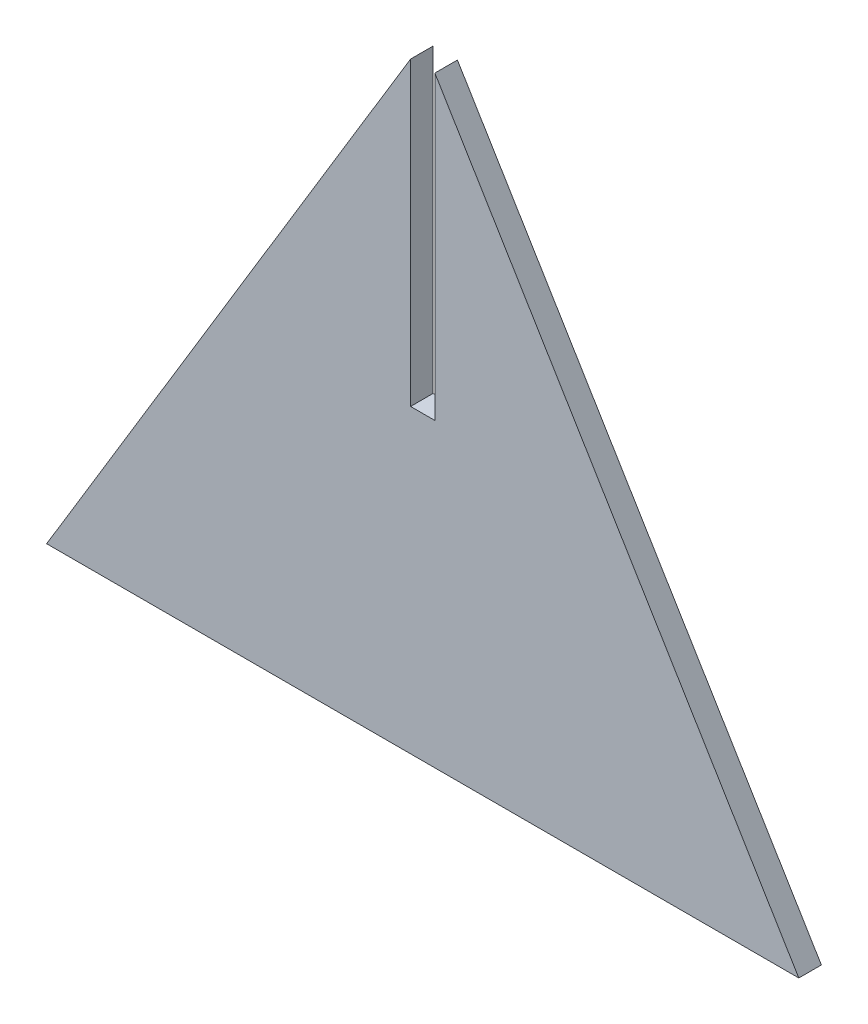
ISO-10303-21;
HEADER;
FILE_DESCRIPTION(('STEP AP214'),'2;1');
FILE_NAME('part.step','',(''),(''),'','','');
FILE_SCHEMA(('AUTOMOTIVE_DESIGN { 1 0 10303 214 1 1 1 1 }'));
ENDSEC;
DATA;
#1=APPLICATION_CONTEXT('core data for automotive mechanical design processes');
#2=APPLICATION_PROTOCOL_DEFINITION('international standard','automotive_design',2000,#1);
#3=PRODUCT_CONTEXT('',#1,'mechanical');
#4=PRODUCT('Part','Part','',(#3));
#5=PRODUCT_RELATED_PRODUCT_CATEGORY('part','',(#4));
#6=PRODUCT_DEFINITION_FORMATION('','',#4);
#7=PRODUCT_DEFINITION_CONTEXT('part definition',#1,'design');
#8=PRODUCT_DEFINITION('design','',#6,#7);
#9=PRODUCT_DEFINITION_SHAPE('','',#8);
#10=(LENGTH_UNIT() NAMED_UNIT(*) SI_UNIT(.MILLI.,.METRE.));
#11=(NAMED_UNIT(*) PLANE_ANGLE_UNIT() SI_UNIT($,.RADIAN.));
#12=(NAMED_UNIT(*) SI_UNIT($,.STERADIAN.) SOLID_ANGLE_UNIT());
#13=UNCERTAINTY_MEASURE_WITH_UNIT(LENGTH_MEASURE(1.E-05),#10,'distance_accuracy_value','');
#14=(GEOMETRIC_REPRESENTATION_CONTEXT(3) GLOBAL_UNCERTAINTY_ASSIGNED_CONTEXT((#13)) GLOBAL_UNIT_ASSIGNED_CONTEXT((#10,
#11,#12)) REPRESENTATION_CONTEXT('',''));
#15=CARTESIAN_POINT('',(0.,0.,0.));
#16=DIRECTION('',(0.,0.,1.));
#17=DIRECTION('',(1.,0.,0.));
#18=AXIS2_PLACEMENT_3D('',#15,#16,#17);
#19=CARTESIAN_POINT('',(-5.1029194416022,40.,3.));
#20=DIRECTION('',(-1.,0.,0.));
#21=DIRECTION('',(0.,0.,1.));
#22=AXIS2_PLACEMENT_3D('',#19,#20,#21);
#23=PLANE('',#22);
#24=DIRECTION('',(0.,1.,0.));
#25=VECTOR('',#24,1.);
#26=CARTESIAN_POINT('',(-5.1029194416022,40.,0.));
#27=LINE('',#26,#25);
#28=CARTESIAN_POINT('',(-5.1029194416022,40.,0.));
#29=VERTEX_POINT('',#28);
#30=CARTESIAN_POINT('',(-5.1029194416022,80.,0.));
#31=VERTEX_POINT('',#30);
#32=EDGE_CURVE('E116',#29,#31,#27,.T.);
#33=ORIENTED_EDGE('',*,*,#32,.T.);
#34=DIRECTION('',(0.,0.,-1.));
#35=VECTOR('',#34,1.);
#36=CARTESIAN_POINT('',(-5.1029194416022,80.,3.));
#37=LINE('',#36,#35);
#38=CARTESIAN_POINT('',(-5.1029194416022,80.,3.));
#39=VERTEX_POINT('',#38);
#40=EDGE_CURVE('E11',#39,#31,#37,.T.);
#41=ORIENTED_EDGE('',*,*,#40,.F.);
#42=DIRECTION('',(0.,1.,0.));
#43=VECTOR('',#42,1.);
#44=CARTESIAN_POINT('',(-5.1029194416022,40.,3.));
#45=LINE('',#44,#43);
#46=CARTESIAN_POINT('',(-5.1029194416022,40.,3.));
#47=VERTEX_POINT('',#46);
#48=EDGE_CURVE('E127',#47,#39,#45,.T.);
#49=ORIENTED_EDGE('',*,*,#48,.F.);
#50=DIRECTION('',(0.,0.,-1.));
#51=VECTOR('',#50,1.);
#52=CARTESIAN_POINT('',(-5.1029194416022,40.,3.));
#53=LINE('',#52,#51);
#54=EDGE_CURVE('E112',#47,#29,#53,.T.);
#55=ORIENTED_EDGE('',*,*,#54,.T.);
#56=EDGE_LOOP('',(#33,#41,#49,#55));
#57=FACE_BOUND('',#56,.T.);
#58=ADVANCED_FACE('F32',(#57),#23,.F.);
#59=CARTESIAN_POINT('',(-5.1029194416022,80.,3.));
#60=DIRECTION('',(0.855660920947977,-0.517536847347567,0.));
#61=DIRECTION('',(0.517536847347567,0.855660920947978,0.));
#62=AXIS2_PLACEMENT_3D('',#59,#60,#61);
#63=PLANE('',#62);
#64=DIRECTION('',(-0.517536847347567,-0.855660920947978,0.));
#65=VECTOR('',#64,1.);
#66=CARTESIAN_POINT('',(-5.1029194416022,80.,0.));
#67=LINE('',#66,#65);
#68=CARTESIAN_POINT('',(-53.4900162157958,0.,0.));
#69=VERTEX_POINT('',#68);
#70=EDGE_CURVE('E119',#31,#69,#67,.T.);
#71=ORIENTED_EDGE('',*,*,#70,.T.);
#72=DIRECTION('',(0.,0.,-1.));
#73=VECTOR('',#72,1.);
#74=CARTESIAN_POINT('',(-53.4900162157958,0.,3.));
#75=LINE('',#74,#73);
#76=CARTESIAN_POINT('',(-53.4900162157958,0.,3.));
#77=VERTEX_POINT('',#76);
#78=EDGE_CURVE('E40',#77,#69,#75,.T.);
#79=ORIENTED_EDGE('',*,*,#78,.F.);
#80=DIRECTION('',(-0.517536847347567,-0.855660920947978,0.));
#81=VECTOR('',#80,1.);
#82=CARTESIAN_POINT('',(-5.1029194416022,80.,3.));
#83=LINE('',#82,#81);
#84=EDGE_CURVE('E85',#39,#77,#83,.T.);
#85=ORIENTED_EDGE('',*,*,#84,.F.);
#86=ORIENTED_EDGE('',*,*,#40,.T.);
#87=EDGE_LOOP('',(#71,#79,#85,#86));
#88=FACE_BOUND('',#87,.T.);
#89=ADVANCED_FACE('F133',(#88),#63,.F.);
#90=CARTESIAN_POINT('',(46.5099837842043,0.,3.));
#91=DIRECTION('',(0.,1.,0.));
#92=DIRECTION('',(-1.,0.,0.));
#93=AXIS2_PLACEMENT_3D('',#90,#91,#92);
#94=PLANE('',#93);
#95=DIRECTION('',(1.,0.,0.));
#96=VECTOR('',#95,1.);
#97=CARTESIAN_POINT('',(46.5099837842043,0.,0.));
#98=LINE('',#97,#96);
#99=CARTESIAN_POINT('',(46.5099837842043,0.,0.));
#100=VERTEX_POINT('',#99);
#101=EDGE_CURVE('E122',#69,#100,#98,.T.);
#102=ORIENTED_EDGE('',*,*,#101,.T.);
#103=DIRECTION('',(0.,0.,-1.));
#104=VECTOR('',#103,1.);
#105=CARTESIAN_POINT('',(46.5099837842043,0.,3.));
#106=LINE('',#105,#104);
#107=CARTESIAN_POINT('',(46.5099837842043,0.,3.));
#108=VERTEX_POINT('',#107);
#109=EDGE_CURVE('E107',#108,#100,#106,.T.);
#110=ORIENTED_EDGE('',*,*,#109,.F.);
#111=DIRECTION('',(1.,0.,0.));
#112=VECTOR('',#111,1.);
#113=CARTESIAN_POINT('',(-53.4900162157958,0.,3.));
#114=LINE('',#113,#112);
#115=EDGE_CURVE('E98',#77,#108,#114,.T.);
#116=ORIENTED_EDGE('',*,*,#115,.F.);
#117=ORIENTED_EDGE('',*,*,#78,.T.);
#118=EDGE_LOOP('',(#102,#110,#116,#117));
#119=FACE_BOUND('',#118,.T.);
#120=ADVANCED_FACE('F132',(#119),#94,.F.);
#121=CARTESIAN_POINT('',(-1.8771129899893,80.,3.));
#122=DIRECTION('',(-0.855660920947977,-0.517536847347567,0.));
#123=DIRECTION('',(0.517536847347567,-0.855660920947978,0.));
#124=AXIS2_PLACEMENT_3D('',#121,#122,#123);
#125=PLANE('',#124);
#126=DIRECTION('',(-0.517536847347567,0.855660920947978,0.));
#127=VECTOR('',#126,1.);
#128=CARTESIAN_POINT('',(-1.8771129899893,80.,0.));
#129=LINE('',#128,#127);
#130=CARTESIAN_POINT('',(-1.8771129899893,80.,0.));
#131=VERTEX_POINT('',#130);
#132=EDGE_CURVE('E106',#100,#131,#129,.T.);
#133=ORIENTED_EDGE('',*,*,#132,.T.);
#134=DIRECTION('',(0.,0.,-1.));
#135=VECTOR('',#134,1.);
#136=CARTESIAN_POINT('',(-1.8771129899893,80.,3.));
#137=LINE('',#136,#135);
#138=CARTESIAN_POINT('',(-1.8771129899893,80.,3.));
#139=VERTEX_POINT('',#138);
#140=EDGE_CURVE('E103',#139,#131,#137,.T.);
#141=ORIENTED_EDGE('',*,*,#140,.F.);
#142=DIRECTION('',(-0.517536847347567,0.855660920947978,0.));
#143=VECTOR('',#142,1.);
#144=CARTESIAN_POINT('',(-1.8771129899893,80.,3.));
#145=LINE('',#144,#143);
#146=EDGE_CURVE('E92',#108,#139,#145,.T.);
#147=ORIENTED_EDGE('',*,*,#146,.F.);
#148=ORIENTED_EDGE('',*,*,#109,.T.);
#149=EDGE_LOOP('',(#133,#141,#147,#148));
#150=FACE_BOUND('',#149,.T.);
#151=ADVANCED_FACE('F104',(#150),#125,.F.);
#152=CARTESIAN_POINT('',(-1.8771129899893,40.,3.));
#153=DIRECTION('',(1.,0.,0.));
#154=DIRECTION('',(0.,1.,0.));
#155=AXIS2_PLACEMENT_3D('',#152,#153,#154);
#156=PLANE('',#155);
#157=DIRECTION('',(0.,-1.,0.));
#158=VECTOR('',#157,1.);
#159=CARTESIAN_POINT('',(-1.8771129899893,40.,0.));
#160=LINE('',#159,#158);
#161=CARTESIAN_POINT('',(-1.8771129899893,40.,0.));
#162=VERTEX_POINT('',#161);
#163=EDGE_CURVE('E71',#131,#162,#160,.T.);
#164=ORIENTED_EDGE('',*,*,#163,.T.);
#165=DIRECTION('',(0.,0.,-1.));
#166=VECTOR('',#165,1.);
#167=CARTESIAN_POINT('',(-1.8771129899893,40.,3.));
#168=LINE('',#167,#166);
#169=CARTESIAN_POINT('',(-1.8771129899893,40.,3.));
#170=VERTEX_POINT('',#169);
#171=EDGE_CURVE('E108',#170,#162,#168,.T.);
#172=ORIENTED_EDGE('',*,*,#171,.F.);
#173=DIRECTION('',(0.,-1.,0.));
#174=VECTOR('',#173,1.);
#175=CARTESIAN_POINT('',(-1.8771129899893,40.,3.));
#176=LINE('',#175,#174);
#177=EDGE_CURVE('E96',#139,#170,#176,.T.);
#178=ORIENTED_EDGE('',*,*,#177,.F.);
#179=ORIENTED_EDGE('',*,*,#140,.T.);
#180=EDGE_LOOP('',(#164,#172,#178,#179));
#181=FACE_BOUND('',#180,.T.);
#182=ADVANCED_FACE('F110',(#181),#156,.F.);
#183=CARTESIAN_POINT('',(-5.1029194416022,40.,3.));
#184=DIRECTION('',(0.,-1.,0.));
#185=DIRECTION('',(0.,0.,-1.));
#186=AXIS2_PLACEMENT_3D('',#183,#184,#185);
#187=PLANE('',#186);
#188=DIRECTION('',(-1.,0.,0.));
#189=VECTOR('',#188,1.);
#190=CARTESIAN_POINT('',(-5.1029194416022,40.,0.));
#191=LINE('',#190,#189);
#192=EDGE_CURVE('E77',#162,#29,#191,.T.);
#193=ORIENTED_EDGE('',*,*,#192,.T.);
#194=ORIENTED_EDGE('',*,*,#54,.F.);
#195=DIRECTION('',(-1.,0.,0.));
#196=VECTOR('',#195,1.);
#197=CARTESIAN_POINT('',(-5.1029194416022,40.,3.));
#198=LINE('',#197,#196);
#199=EDGE_CURVE('E48',#170,#47,#198,.T.);
#200=ORIENTED_EDGE('',*,*,#199,.F.);
#201=ORIENTED_EDGE('',*,*,#171,.T.);
#202=EDGE_LOOP('',(#193,#194,#200,#201));
#203=FACE_BOUND('',#202,.T.);
#204=ADVANCED_FACE('F140',(#203),#187,.F.);
#205=CARTESIAN_POINT('',(0.,0.,3.));
#206=DIRECTION('',(0.,0.,-1.));
#207=DIRECTION('',(-1.,0.,0.));
#208=AXIS2_PLACEMENT_3D('',#205,#206,#207);
#209=PLANE('',#208);
#210=ORIENTED_EDGE('',*,*,#48,.T.);
#211=ORIENTED_EDGE('',*,*,#84,.T.);
#212=ORIENTED_EDGE('',*,*,#115,.T.);
#213=ORIENTED_EDGE('',*,*,#146,.T.);
#214=ORIENTED_EDGE('',*,*,#177,.T.);
#215=ORIENTED_EDGE('',*,*,#199,.T.);
#216=EDGE_LOOP('',(#210,#211,#212,#213,#214,#215));
#217=FACE_BOUND('',#216,.T.);
#218=ADVANCED_FACE('F94',(#217),#209,.F.);
#219=CARTESIAN_POINT('',(0.,0.,0.));
#220=DIRECTION('',(0.,0.,-1.));
#221=DIRECTION('',(-1.,0.,0.));
#222=AXIS2_PLACEMENT_3D('',#219,#220,#221);
#223=PLANE('',#222);
#224=ORIENTED_EDGE('',*,*,#32,.F.);
#225=ORIENTED_EDGE('',*,*,#192,.F.);
#226=ORIENTED_EDGE('',*,*,#163,.F.);
#227=ORIENTED_EDGE('',*,*,#132,.F.);
#228=ORIENTED_EDGE('',*,*,#101,.F.);
#229=ORIENTED_EDGE('',*,*,#70,.F.);
#230=EDGE_LOOP('',(#224,#225,#226,#227,#228,#229));
#231=FACE_BOUND('',#230,.T.);
#232=ADVANCED_FACE('F137',(#231),#223,.T.);
#233=CLOSED_SHELL('',(#58,#89,#120,#151,#182,#204,#218,#232));
#234=MANIFOLD_SOLID_BREP('B2',#233);
#235=ADVANCED_BREP_SHAPE_REPRESENTATION('',(#18,#234),#14);
#236=SHAPE_DEFINITION_REPRESENTATION(#9,#235);
ENDSEC;
END-ISO-10303-21;
